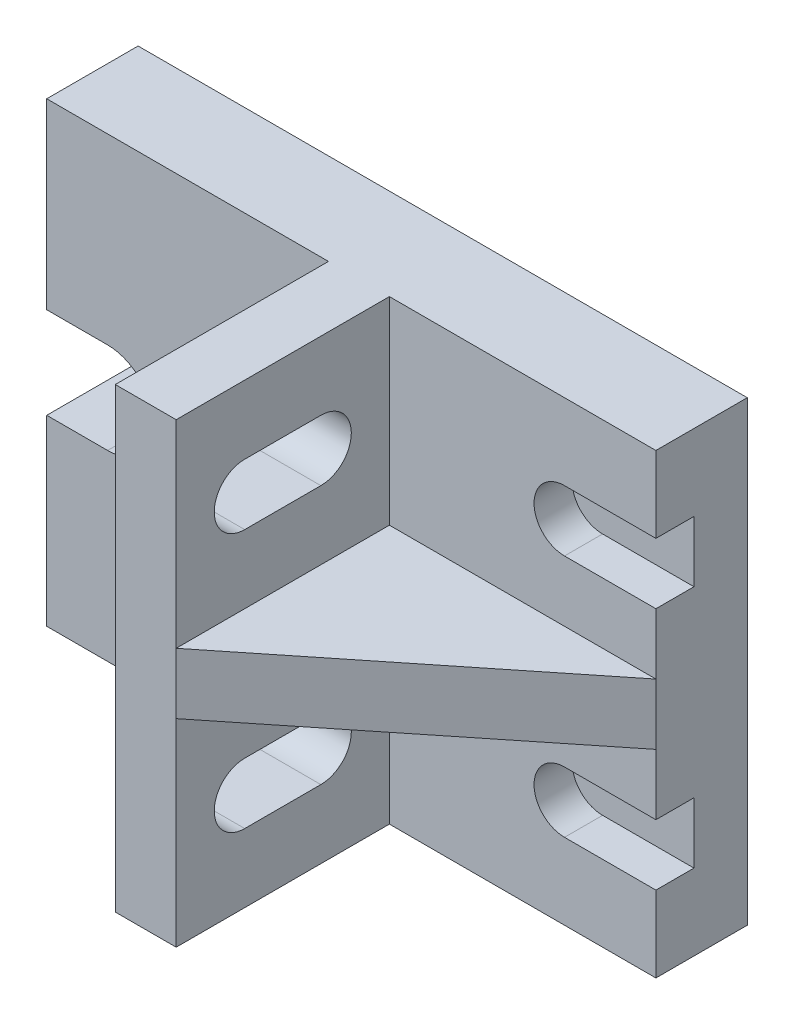
ISO-10303-21;
HEADER;
FILE_DESCRIPTION(('STEP AP214'),'2;1');
FILE_NAME('part.step','',(''),(''),'','','');
FILE_SCHEMA(('AUTOMOTIVE_DESIGN { 1 0 10303 214 1 1 1 1 }'));
ENDSEC;
DATA;
#1=APPLICATION_CONTEXT('core data for automotive mechanical design processes');
#2=APPLICATION_PROTOCOL_DEFINITION('international standard','automotive_design',2000,#1);
#3=PRODUCT_CONTEXT('',#1,'mechanical');
#4=PRODUCT('Part','Part','',(#3));
#5=PRODUCT_RELATED_PRODUCT_CATEGORY('part','',(#4));
#6=PRODUCT_DEFINITION_FORMATION('','',#4);
#7=PRODUCT_DEFINITION_CONTEXT('part definition',#1,'design');
#8=PRODUCT_DEFINITION('design','',#6,#7);
#9=PRODUCT_DEFINITION_SHAPE('','',#8);
#10=(LENGTH_UNIT() NAMED_UNIT(*) SI_UNIT(.MILLI.,.METRE.));
#11=(NAMED_UNIT(*) PLANE_ANGLE_UNIT() SI_UNIT($,.RADIAN.));
#12=(NAMED_UNIT(*) SI_UNIT($,.STERADIAN.) SOLID_ANGLE_UNIT());
#13=UNCERTAINTY_MEASURE_WITH_UNIT(LENGTH_MEASURE(1.E-05),#10,'distance_accuracy_value','');
#14=(GEOMETRIC_REPRESENTATION_CONTEXT(3) GLOBAL_UNCERTAINTY_ASSIGNED_CONTEXT((#13)) GLOBAL_UNIT_ASSIGNED_CONTEXT((#10,
#11,#12)) REPRESENTATION_CONTEXT('',''));
#15=CARTESIAN_POINT('',(0.,0.,0.));
#16=DIRECTION('',(0.,0.,1.));
#17=DIRECTION('',(1.,0.,0.));
#18=AXIS2_PLACEMENT_3D('',#15,#16,#17);
#19=CARTESIAN_POINT('',(0.,0.,30.));
#20=DIRECTION('',(0.,0.,1.));
#21=DIRECTION('',(1.,0.,0.));
#22=AXIS2_PLACEMENT_3D('',#19,#20,#21);
#23=PLANE('',#22);
#24=DIRECTION('',(0.,1.,0.));
#25=VECTOR('',#24,1.);
#26=CARTESIAN_POINT('',(200.,0.,30.));
#27=LINE('',#26,#25);
#28=CARTESIAN_POINT('',(200.,-105.,30.));
#29=VERTEX_POINT('',#28);
#30=CARTESIAN_POINT('',(200.,-85.,30.));
#31=VERTEX_POINT('',#30);
#32=EDGE_CURVE('E448',#29,#31,#27,.T.);
#33=ORIENTED_EDGE('',*,*,#32,.T.);
#34=DIRECTION('',(-1.,0.,0.));
#35=VECTOR('',#34,1.);
#36=CARTESIAN_POINT('',(200.,-85.,30.));
#37=LINE('',#36,#35);
#38=CARTESIAN_POINT('',(112.5,-85.,30.));
#39=VERTEX_POINT('',#38);
#40=EDGE_CURVE('E300',#31,#39,#37,.T.);
#41=ORIENTED_EDGE('',*,*,#40,.T.);
#42=DIRECTION('',(0.,-1.,0.));
#43=VECTOR('',#42,1.);
#44=CARTESIAN_POINT('',(112.5,0.,30.));
#45=LINE('',#44,#43);
#46=CARTESIAN_POINT('',(112.5,-150.,30.));
#47=VERTEX_POINT('',#46);
#48=EDGE_CURVE('E320',#39,#47,#45,.T.);
#49=ORIENTED_EDGE('',*,*,#48,.T.);
#50=DIRECTION('',(1.,0.,0.));
#51=VECTOR('',#50,1.);
#52=CARTESIAN_POINT('',(0.,-150.,30.));
#53=LINE('',#52,#51);
#54=CARTESIAN_POINT('',(200.,-150.,30.));
#55=VERTEX_POINT('',#54);
#56=EDGE_CURVE('E438',#47,#55,#53,.T.);
#57=ORIENTED_EDGE('',*,*,#56,.T.);
#58=CARTESIAN_POINT('',(200.,-125.,30.));
#59=VERTEX_POINT('',#58);
#60=EDGE_CURVE('E444',#55,#59,#27,.T.);
#61=ORIENTED_EDGE('',*,*,#60,.T.);
#62=DIRECTION('',(1.,0.,0.));
#63=VECTOR('',#62,1.);
#64=CARTESIAN_POINT('',(200.,-125.,30.));
#65=LINE('',#64,#63);
#66=CARTESIAN_POINT('',(170.,-125.,30.));
#67=VERTEX_POINT('',#66);
#68=EDGE_CURVE('E381',#67,#59,#65,.T.);
#69=ORIENTED_EDGE('',*,*,#68,.F.);
#70=CARTESIAN_POINT('',(170.,-115.,30.));
#71=DIRECTION('',(0.,0.,1.));
#72=DIRECTION('',(-1.,0.,0.));
#73=AXIS2_PLACEMENT_3D('',#70,#71,#72);
#74=CIRCLE('',#73,10.);
#75=CARTESIAN_POINT('',(170.,-105.,30.));
#76=VERTEX_POINT('',#75);
#77=EDGE_CURVE('E394',#76,#67,#74,.T.);
#78=ORIENTED_EDGE('',*,*,#77,.F.);
#79=DIRECTION('',(-1.,0.,0.));
#80=VECTOR('',#79,1.);
#81=CARTESIAN_POINT('',(200.,-105.,30.));
#82=LINE('',#81,#80);
#83=EDGE_CURVE('E391',#29,#76,#82,.T.);
#84=ORIENTED_EDGE('',*,*,#83,.F.);
#85=EDGE_LOOP('',(#33,#41,#49,#57,#61,#69,#78,#84));
#86=FACE_BOUND('',#85,.T.);
#87=ADVANCED_FACE('F33',(#86),#23,.T.);
#88=CARTESIAN_POINT('',(112.5,0.,100.));
#89=DIRECTION('',(1.,0.,0.));
#90=DIRECTION('',(0.,1.,0.));
#91=AXIS2_PLACEMENT_3D('',#88,#89,#90);
#92=PLANE('',#91);
#93=CARTESIAN_POINT('',(112.5,-117.5,52.5));
#94=DIRECTION('',(1.,0.,0.));
#95=DIRECTION('',(0.,1.,0.));
#96=AXIS2_PLACEMENT_3D('',#93,#94,#95);
#97=CIRCLE('',#96,10.);
#98=CARTESIAN_POINT('',(112.5,-127.5,52.5));
#99=VERTEX_POINT('',#98);
#100=CARTESIAN_POINT('',(112.5,-107.5,52.5));
#101=VERTEX_POINT('',#100);
#102=EDGE_CURVE('E48',#99,#101,#97,.T.);
#103=ORIENTED_EDGE('',*,*,#102,.F.);
#104=DIRECTION('',(0.,0.,-1.));
#105=VECTOR('',#104,1.);
#106=CARTESIAN_POINT('',(112.5,-127.5,52.5));
#107=LINE('',#106,#105);
#108=CARTESIAN_POINT('',(112.5,-127.5,77.5));
#109=VERTEX_POINT('',#108);
#110=EDGE_CURVE('E260',#109,#99,#107,.T.);
#111=ORIENTED_EDGE('',*,*,#110,.F.);
#112=CARTESIAN_POINT('',(112.5,-117.5,77.5));
#113=DIRECTION('',(1.,0.,0.));
#114=DIRECTION('',(0.,1.,0.));
#115=AXIS2_PLACEMENT_3D('',#112,#113,#114);
#116=CIRCLE('',#115,10.);
#117=CARTESIAN_POINT('',(112.5,-107.5,77.5));
#118=VERTEX_POINT('',#117);
#119=EDGE_CURVE('E243',#118,#109,#116,.T.);
#120=ORIENTED_EDGE('',*,*,#119,.F.);
#121=DIRECTION('',(0.,0.,1.));
#122=VECTOR('',#121,1.);
#123=CARTESIAN_POINT('',(112.5,-107.5,52.5));
#124=LINE('',#123,#122);
#125=EDGE_CURVE('E253',#101,#118,#124,.T.);
#126=ORIENTED_EDGE('',*,*,#125,.F.);
#127=EDGE_LOOP('',(#103,#111,#120,#126));
#128=FACE_BOUND('',#127,.T.);
#129=ORIENTED_EDGE('',*,*,#48,.F.);
#130=DIRECTION('',(0.,0.,1.));
#131=VECTOR('',#130,1.);
#132=CARTESIAN_POINT('',(112.5,-85.,30.));
#133=LINE('',#132,#131);
#134=CARTESIAN_POINT('',(112.5,-85.,100.));
#135=VERTEX_POINT('',#134);
#136=EDGE_CURVE('E302',#39,#135,#133,.T.);
#137=ORIENTED_EDGE('',*,*,#136,.T.);
#138=DIRECTION('',(0.,-1.,0.));
#139=VECTOR('',#138,1.);
#140=CARTESIAN_POINT('',(112.5,0.,100.));
#141=LINE('',#140,#139);
#142=CARTESIAN_POINT('',(112.5,-150.,100.));
#143=VERTEX_POINT('',#142);
#144=EDGE_CURVE('E325',#135,#143,#141,.T.);
#145=ORIENTED_EDGE('',*,*,#144,.T.);
#146=DIRECTION('',(0.,0.,-1.));
#147=VECTOR('',#146,1.);
#148=CARTESIAN_POINT('',(112.5,-150.,100.));
#149=LINE('',#148,#147);
#150=EDGE_CURVE('E346',#143,#47,#149,.T.);
#151=ORIENTED_EDGE('',*,*,#150,.T.);
#152=EDGE_LOOP('',(#129,#137,#145,#151));
#153=FACE_BOUND('',#152,.T.);
#154=ADVANCED_FACE('F257',(#128,#153),#92,.T.);
#155=DIRECTION('',(-1.,0.,0.));
#156=VECTOR('',#155,1.);
#157=CARTESIAN_POINT('',(200.,-65.,30.));
#158=LINE('',#157,#156);
#159=CARTESIAN_POINT('',(200.,-65.,30.));
#160=VERTEX_POINT('',#159);
#161=CARTESIAN_POINT('',(112.5,-65.,30.));
#162=VERTEX_POINT('',#161);
#163=EDGE_CURVE('E271',#160,#162,#158,.T.);
#164=ORIENTED_EDGE('',*,*,#163,.F.);
#165=CARTESIAN_POINT('',(200.,-45.,30.));
#166=VERTEX_POINT('',#165);
#167=EDGE_CURVE('E449',#160,#166,#27,.T.);
#168=ORIENTED_EDGE('',*,*,#167,.T.);
#169=DIRECTION('',(1.,0.,0.));
#170=VECTOR('',#169,1.);
#171=CARTESIAN_POINT('',(200.,-45.,30.));
#172=LINE('',#171,#170);
#173=CARTESIAN_POINT('',(170.,-45.,30.));
#174=VERTEX_POINT('',#173);
#175=EDGE_CURVE('E422',#174,#166,#172,.T.);
#176=ORIENTED_EDGE('',*,*,#175,.F.);
#177=CARTESIAN_POINT('',(170.,-35.,30.));
#178=DIRECTION('',(0.,0.,1.));
#179=DIRECTION('',(1.,0.,0.));
#180=AXIS2_PLACEMENT_3D('',#177,#178,#179);
#181=CIRCLE('',#180,10.);
#182=CARTESIAN_POINT('',(170.,-25.,30.));
#183=VERTEX_POINT('',#182);
#184=EDGE_CURVE('E376',#183,#174,#181,.T.);
#185=ORIENTED_EDGE('',*,*,#184,.F.);
#186=DIRECTION('',(-1.,0.,0.));
#187=VECTOR('',#186,1.);
#188=CARTESIAN_POINT('',(200.,-25.,30.));
#189=LINE('',#188,#187);
#190=CARTESIAN_POINT('',(200.,-25.,30.));
#191=VERTEX_POINT('',#190);
#192=EDGE_CURVE('E412',#191,#183,#189,.T.);
#193=ORIENTED_EDGE('',*,*,#192,.F.);
#194=CARTESIAN_POINT('',(200.,0.,30.));
#195=VERTEX_POINT('',#194);
#196=EDGE_CURVE('E443',#191,#195,#27,.T.);
#197=ORIENTED_EDGE('',*,*,#196,.T.);
#198=DIRECTION('',(-1.,0.,0.));
#199=VECTOR('',#198,1.);
#200=CARTESIAN_POINT('',(0.,0.,30.));
#201=LINE('',#200,#199);
#202=CARTESIAN_POINT('',(112.5,0.,30.));
#203=VERTEX_POINT('',#202);
#204=EDGE_CURVE('E450',#195,#203,#201,.T.);
#205=ORIENTED_EDGE('',*,*,#204,.T.);
#206=EDGE_CURVE('E336',#203,#162,#45,.T.);
#207=ORIENTED_EDGE('',*,*,#206,.T.);
#208=EDGE_LOOP('',(#164,#168,#176,#185,#193,#197,#205,#207));
#209=FACE_BOUND('',#208,.T.);
#210=ADVANCED_FACE('F556',(#209),#23,.T.);
#211=CARTESIAN_POINT('',(0.,0.,30.));
#212=DIRECTION('',(1.,0.,0.));
#213=DIRECTION('',(0.,1.,0.));
#214=AXIS2_PLACEMENT_3D('',#211,#212,#213);
#215=PLANE('',#214);
#216=DIRECTION('',(0.,0.,1.));
#217=VECTOR('',#216,1.);
#218=CARTESIAN_POINT('',(0.,-60.,0.));
#219=LINE('',#218,#217);
#220=CARTESIAN_POINT('',(0.,-60.,0.));
#221=VERTEX_POINT('',#220);
#222=CARTESIAN_POINT('',(0.,-60.,30.));
#223=VERTEX_POINT('',#222);
#224=EDGE_CURVE('E359',#221,#223,#219,.T.);
#225=ORIENTED_EDGE('',*,*,#224,.T.);
#226=DIRECTION('',(0.,-1.,0.));
#227=VECTOR('',#226,1.);
#228=CARTESIAN_POINT('',(0.,0.,30.));
#229=LINE('',#228,#227);
#230=CARTESIAN_POINT('',(0.,0.,30.));
#231=VERTEX_POINT('',#230);
#232=EDGE_CURVE('E435',#231,#223,#229,.T.);
#233=ORIENTED_EDGE('',*,*,#232,.F.);
#234=DIRECTION('',(0.,0.,-1.));
#235=VECTOR('',#234,1.);
#236=CARTESIAN_POINT('',(0.,0.,30.));
#237=LINE('',#236,#235);
#238=CARTESIAN_POINT('',(0.,0.,0.));
#239=VERTEX_POINT('',#238);
#240=EDGE_CURVE('E453',#231,#239,#237,.T.);
#241=ORIENTED_EDGE('',*,*,#240,.T.);
#242=DIRECTION('',(0.,-1.,0.));
#243=VECTOR('',#242,1.);
#244=CARTESIAN_POINT('',(0.,0.,0.));
#245=LINE('',#244,#243);
#246=EDGE_CURVE('E454',#239,#221,#245,.T.);
#247=ORIENTED_EDGE('',*,*,#246,.T.);
#248=EDGE_LOOP('',(#225,#233,#241,#247));
#249=FACE_BOUND('',#248,.T.);
#250=ADVANCED_FACE('F491',(#249),#215,.F.);
#251=DIRECTION('',(0.,-1.,0.));
#252=VECTOR('',#251,1.);
#253=CARTESIAN_POINT('',(92.5,0.,30.));
#254=LINE('',#253,#252);
#255=CARTESIAN_POINT('',(92.5,0.,30.));
#256=VERTEX_POINT('',#255);
#257=CARTESIAN_POINT('',(92.5,-150.,30.));
#258=VERTEX_POINT('',#257);
#259=EDGE_CURVE('E326',#256,#258,#254,.T.);
#260=ORIENTED_EDGE('',*,*,#259,.F.);
#261=EDGE_CURVE('E447',#256,#231,#201,.T.);
#262=ORIENTED_EDGE('',*,*,#261,.T.);
#263=ORIENTED_EDGE('',*,*,#232,.T.);
#264=DIRECTION('',(1.,0.,0.));
#265=VECTOR('',#264,1.);
#266=CARTESIAN_POINT('',(0.,-60.,30.));
#267=LINE('',#266,#265);
#268=CARTESIAN_POINT('',(20.,-60.,30.));
#269=VERTEX_POINT('',#268);
#270=EDGE_CURVE('E349',#223,#269,#267,.T.);
#271=ORIENTED_EDGE('',*,*,#270,.T.);
#272=CARTESIAN_POINT('',(20.,-75.,30.));
#273=DIRECTION('',(0.,0.,-1.));
#274=DIRECTION('',(-1.,0.,0.));
#275=AXIS2_PLACEMENT_3D('',#272,#273,#274);
#276=CIRCLE('',#275,15.);
#277=CARTESIAN_POINT('',(20.,-90.,30.));
#278=VERTEX_POINT('',#277);
#279=EDGE_CURVE('E362',#269,#278,#276,.T.);
#280=ORIENTED_EDGE('',*,*,#279,.T.);
#281=DIRECTION('',(1.,0.,0.));
#282=VECTOR('',#281,1.);
#283=CARTESIAN_POINT('',(0.,-90.,30.));
#284=LINE('',#283,#282);
#285=CARTESIAN_POINT('',(0.,-90.,30.));
#286=VERTEX_POINT('',#285);
#287=EDGE_CURVE('E353',#286,#278,#284,.T.);
#288=ORIENTED_EDGE('',*,*,#287,.F.);
#289=CARTESIAN_POINT('',(0.,-150.,30.));
#290=VERTEX_POINT('',#289);
#291=EDGE_CURVE('E439',#286,#290,#229,.T.);
#292=ORIENTED_EDGE('',*,*,#291,.T.);
#293=EDGE_CURVE('E440',#290,#258,#53,.T.);
#294=ORIENTED_EDGE('',*,*,#293,.T.);
#295=EDGE_LOOP('',(#260,#262,#263,#271,#280,#288,#292,#294));
#296=FACE_BOUND('',#295,.T.);
#297=ADVANCED_FACE('F494',(#296),#23,.T.);
#298=CARTESIAN_POINT('',(0.,0.,0.));
#299=DIRECTION('',(0.,0.,1.));
#300=DIRECTION('',(1.,0.,0.));
#301=AXIS2_PLACEMENT_3D('',#298,#299,#300);
#302=PLANE('',#301);
#303=DIRECTION('',(1.,0.,0.));
#304=VECTOR('',#303,1.);
#305=CARTESIAN_POINT('',(0.,-60.,0.));
#306=LINE('',#305,#304);
#307=CARTESIAN_POINT('',(20.,-60.,0.));
#308=VERTEX_POINT('',#307);
#309=EDGE_CURVE('E350',#221,#308,#306,.T.);
#310=ORIENTED_EDGE('',*,*,#309,.F.);
#311=ORIENTED_EDGE('',*,*,#246,.F.);
#312=DIRECTION('',(-1.,0.,0.));
#313=VECTOR('',#312,1.);
#314=CARTESIAN_POINT('',(0.,0.,0.));
#315=LINE('',#314,#313);
#316=CARTESIAN_POINT('',(200.,0.,0.));
#317=VERTEX_POINT('',#316);
#318=EDGE_CURVE('E461',#317,#239,#315,.T.);
#319=ORIENTED_EDGE('',*,*,#318,.F.);
#320=DIRECTION('',(0.,1.,0.));
#321=VECTOR('',#320,1.);
#322=CARTESIAN_POINT('',(200.,0.,0.));
#323=LINE('',#322,#321);
#324=CARTESIAN_POINT('',(200.,-150.,0.));
#325=VERTEX_POINT('',#324);
#326=EDGE_CURVE('E459',#325,#317,#323,.T.);
#327=ORIENTED_EDGE('',*,*,#326,.F.);
#328=DIRECTION('',(1.,0.,0.));
#329=VECTOR('',#328,1.);
#330=CARTESIAN_POINT('',(0.,-150.,0.));
#331=LINE('',#330,#329);
#332=CARTESIAN_POINT('',(0.,-150.,0.));
#333=VERTEX_POINT('',#332);
#334=EDGE_CURVE('E457',#333,#325,#331,.T.);
#335=ORIENTED_EDGE('',*,*,#334,.F.);
#336=CARTESIAN_POINT('',(0.,-90.,0.));
#337=VERTEX_POINT('',#336);
#338=EDGE_CURVE('E402',#337,#333,#245,.T.);
#339=ORIENTED_EDGE('',*,*,#338,.F.);
#340=DIRECTION('',(1.,0.,0.));
#341=VECTOR('',#340,1.);
#342=CARTESIAN_POINT('',(0.,-90.,0.));
#343=LINE('',#342,#341);
#344=CARTESIAN_POINT('',(20.,-90.,0.));
#345=VERTEX_POINT('',#344);
#346=EDGE_CURVE('E356',#337,#345,#343,.T.);
#347=ORIENTED_EDGE('',*,*,#346,.T.);
#348=CARTESIAN_POINT('',(20.,-75.,0.));
#349=DIRECTION('',(0.,0.,-1.));
#350=DIRECTION('',(-1.,0.,0.));
#351=AXIS2_PLACEMENT_3D('',#348,#349,#350);
#352=CIRCLE('',#351,15.);
#353=EDGE_CURVE('E352',#308,#345,#352,.T.);
#354=ORIENTED_EDGE('',*,*,#353,.F.);
#355=EDGE_LOOP('',(#310,#311,#319,#327,#335,#339,#347,#354));
#356=FACE_BOUND('',#355,.T.);
#357=ADVANCED_FACE('F481',(#356),#302,.F.);
#358=ORIENTED_EDGE('',*,*,#291,.F.);
#359=DIRECTION('',(0.,0.,1.));
#360=VECTOR('',#359,1.);
#361=CARTESIAN_POINT('',(0.,-90.,0.));
#362=LINE('',#361,#360);
#363=EDGE_CURVE('E369',#337,#286,#362,.T.);
#364=ORIENTED_EDGE('',*,*,#363,.F.);
#365=ORIENTED_EDGE('',*,*,#338,.T.);
#366=DIRECTION('',(0.,0.,-1.));
#367=VECTOR('',#366,1.);
#368=CARTESIAN_POINT('',(0.,-150.,30.));
#369=LINE('',#368,#367);
#370=EDGE_CURVE('E11',#290,#333,#369,.T.);
#371=ORIENTED_EDGE('',*,*,#370,.F.);
#372=EDGE_LOOP('',(#358,#364,#365,#371));
#373=FACE_BOUND('',#372,.T.);
#374=ADVANCED_FACE('F35',(#373),#215,.F.);
#375=CARTESIAN_POINT('',(0.,-150.,30.));
#376=DIRECTION('',(0.,1.,0.));
#377=DIRECTION('',(0.,0.,1.));
#378=AXIS2_PLACEMENT_3D('',#375,#376,#377);
#379=PLANE('',#378);
#380=ORIENTED_EDGE('',*,*,#334,.T.);
#381=DIRECTION('',(0.,0.,-1.));
#382=VECTOR('',#381,1.);
#383=CARTESIAN_POINT('',(200.,-150.,30.));
#384=LINE('',#383,#382);
#385=EDGE_CURVE('E41',#55,#325,#384,.T.);
#386=ORIENTED_EDGE('',*,*,#385,.F.);
#387=ORIENTED_EDGE('',*,*,#56,.F.);
#388=ORIENTED_EDGE('',*,*,#150,.F.);
#389=DIRECTION('',(1.,0.,0.));
#390=VECTOR('',#389,1.);
#391=CARTESIAN_POINT('',(92.5,-150.,100.));
#392=LINE('',#391,#390);
#393=CARTESIAN_POINT('',(92.5,-150.,100.));
#394=VERTEX_POINT('',#393);
#395=EDGE_CURVE('E322',#394,#143,#392,.T.);
#396=ORIENTED_EDGE('',*,*,#395,.F.);
#397=DIRECTION('',(0.,0.,-1.));
#398=VECTOR('',#397,1.);
#399=CARTESIAN_POINT('',(92.5,-150.,100.));
#400=LINE('',#399,#398);
#401=EDGE_CURVE('E335',#394,#258,#400,.T.);
#402=ORIENTED_EDGE('',*,*,#401,.T.);
#403=ORIENTED_EDGE('',*,*,#293,.F.);
#404=ORIENTED_EDGE('',*,*,#370,.T.);
#405=EDGE_LOOP('',(#380,#386,#387,#388,#396,#402,#403,#404));
#406=FACE_BOUND('',#405,.T.);
#407=ADVANCED_FACE('F528',(#406),#379,.F.);
#408=CARTESIAN_POINT('',(200.,0.,30.));
#409=DIRECTION('',(-1.,0.,0.));
#410=DIRECTION('',(0.,-1.,0.));
#411=AXIS2_PLACEMENT_3D('',#408,#409,#410);
#412=PLANE('',#411);
#413=DIRECTION('',(0.,1.,0.));
#414=VECTOR('',#413,1.);
#415=CARTESIAN_POINT('',(200.,-105.,17.5));
#416=LINE('',#415,#414);
#417=CARTESIAN_POINT('',(200.,-125.,17.5));
#418=VERTEX_POINT('',#417);
#419=CARTESIAN_POINT('',(200.,-105.,17.5));
#420=VERTEX_POINT('',#419);
#421=EDGE_CURVE('E377',#418,#420,#416,.T.);
#422=ORIENTED_EDGE('',*,*,#421,.F.);
#423=DIRECTION('',(0.,0.,1.));
#424=VECTOR('',#423,1.);
#425=CARTESIAN_POINT('',(200.,-125.,17.5));
#426=LINE('',#425,#424);
#427=EDGE_CURVE('E399',#418,#59,#426,.T.);
#428=ORIENTED_EDGE('',*,*,#427,.T.);
#429=ORIENTED_EDGE('',*,*,#60,.F.);
#430=ORIENTED_EDGE('',*,*,#385,.T.);
#431=ORIENTED_EDGE('',*,*,#326,.T.);
#432=DIRECTION('',(0.,0.,-1.));
#433=VECTOR('',#432,1.);
#434=CARTESIAN_POINT('',(200.,0.,30.));
#435=LINE('',#434,#433);
#436=EDGE_CURVE('E465',#195,#317,#435,.T.);
#437=ORIENTED_EDGE('',*,*,#436,.F.);
#438=ORIENTED_EDGE('',*,*,#196,.F.);
#439=DIRECTION('',(0.,0.,1.));
#440=VECTOR('',#439,1.);
#441=CARTESIAN_POINT('',(200.,-25.,17.5));
#442=LINE('',#441,#440);
#443=CARTESIAN_POINT('',(200.,-25.,17.5));
#444=VERTEX_POINT('',#443);
#445=EDGE_CURVE('E428',#444,#191,#442,.T.);
#446=ORIENTED_EDGE('',*,*,#445,.F.);
#447=DIRECTION('',(0.,1.,0.));
#448=VECTOR('',#447,1.);
#449=CARTESIAN_POINT('',(200.,-25.,17.5));
#450=LINE('',#449,#448);
#451=CARTESIAN_POINT('',(200.,-45.,17.5));
#452=VERTEX_POINT('',#451);
#453=EDGE_CURVE('E415',#452,#444,#450,.T.);
#454=ORIENTED_EDGE('',*,*,#453,.F.);
#455=DIRECTION('',(0.,0.,1.));
#456=VECTOR('',#455,1.);
#457=CARTESIAN_POINT('',(200.,-45.,17.5));
#458=LINE('',#457,#456);
#459=EDGE_CURVE('E430',#452,#166,#458,.T.);
#460=ORIENTED_EDGE('',*,*,#459,.T.);
#461=ORIENTED_EDGE('',*,*,#167,.F.);
#462=DIRECTION('',(0.,1.,0.));
#463=VECTOR('',#462,1.);
#464=CARTESIAN_POINT('',(200.,-85.,30.));
#465=LINE('',#464,#463);
#466=EDGE_CURVE('E317',#31,#160,#465,.T.);
#467=ORIENTED_EDGE('',*,*,#466,.F.);
#468=ORIENTED_EDGE('',*,*,#32,.F.);
#469=DIRECTION('',(0.,0.,1.));
#470=VECTOR('',#469,1.);
#471=CARTESIAN_POINT('',(200.,-105.,17.5));
#472=LINE('',#471,#470);
#473=EDGE_CURVE('E390',#420,#29,#472,.T.);
#474=ORIENTED_EDGE('',*,*,#473,.F.);
#475=EDGE_LOOP('',(#422,#428,#429,#430,#431,#437,#438,#446,#454,#460,#461,#467,#468,#474));
#476=FACE_BOUND('',#475,.T.);
#477=ADVANCED_FACE('F473',(#476),#412,.F.);
#478=CARTESIAN_POINT('',(0.,0.,30.));
#479=DIRECTION('',(0.,-1.,0.));
#480=DIRECTION('',(0.,0.,-1.));
#481=AXIS2_PLACEMENT_3D('',#478,#479,#480);
#482=PLANE('',#481);
#483=ORIENTED_EDGE('',*,*,#318,.T.);
#484=ORIENTED_EDGE('',*,*,#240,.F.);
#485=ORIENTED_EDGE('',*,*,#261,.F.);
#486=DIRECTION('',(0.,0.,-1.));
#487=VECTOR('',#486,1.);
#488=CARTESIAN_POINT('',(92.5,0.,100.));
#489=LINE('',#488,#487);
#490=CARTESIAN_POINT('',(92.5,0.,100.));
#491=VERTEX_POINT('',#490);
#492=EDGE_CURVE('E342',#491,#256,#489,.T.);
#493=ORIENTED_EDGE('',*,*,#492,.F.);
#494=DIRECTION('',(1.,0.,0.));
#495=VECTOR('',#494,1.);
#496=CARTESIAN_POINT('',(92.5,0.,100.));
#497=LINE('',#496,#495);
#498=CARTESIAN_POINT('',(112.5,0.,100.));
#499=VERTEX_POINT('',#498);
#500=EDGE_CURVE('E330',#491,#499,#497,.T.);
#501=ORIENTED_EDGE('',*,*,#500,.T.);
#502=DIRECTION('',(0.,0.,-1.));
#503=VECTOR('',#502,1.);
#504=CARTESIAN_POINT('',(112.5,0.,100.));
#505=LINE('',#504,#503);
#506=EDGE_CURVE('E344',#499,#203,#505,.T.);
#507=ORIENTED_EDGE('',*,*,#506,.T.);
#508=ORIENTED_EDGE('',*,*,#204,.F.);
#509=ORIENTED_EDGE('',*,*,#436,.T.);
#510=EDGE_LOOP('',(#483,#484,#485,#493,#501,#507,#508,#509));
#511=FACE_BOUND('',#510,.T.);
#512=ADVANCED_FACE('F486',(#511),#482,.F.);
#513=CARTESIAN_POINT('',(170.,-35.,17.5));
#514=DIRECTION('',(0.,0.,1.));
#515=DIRECTION('',(1.,0.,0.));
#516=AXIS2_PLACEMENT_3D('',#513,#514,#515);
#517=CYLINDRICAL_SURFACE('',#516,10.);
#518=ORIENTED_EDGE('',*,*,#184,.T.);
#519=DIRECTION('',(0.,0.,1.));
#520=VECTOR('',#519,1.);
#521=CARTESIAN_POINT('',(170.,-45.,17.5));
#522=LINE('',#521,#520);
#523=CARTESIAN_POINT('',(170.,-45.,17.5));
#524=VERTEX_POINT('',#523);
#525=EDGE_CURVE('E420',#524,#174,#522,.T.);
#526=ORIENTED_EDGE('',*,*,#525,.F.);
#527=CARTESIAN_POINT('',(170.,-35.,17.5));
#528=DIRECTION('',(0.,0.,1.));
#529=DIRECTION('',(1.,0.,0.));
#530=AXIS2_PLACEMENT_3D('',#527,#528,#529);
#531=CIRCLE('',#530,10.);
#532=CARTESIAN_POINT('',(170.,-25.,17.5));
#533=VERTEX_POINT('',#532);
#534=EDGE_CURVE('E408',#533,#524,#531,.T.);
#535=ORIENTED_EDGE('',*,*,#534,.F.);
#536=DIRECTION('',(0.,0.,1.));
#537=VECTOR('',#536,1.);
#538=CARTESIAN_POINT('',(170.,-25.,17.5));
#539=LINE('',#538,#537);
#540=EDGE_CURVE('E395',#533,#183,#539,.T.);
#541=ORIENTED_EDGE('',*,*,#540,.T.);
#542=EDGE_LOOP('',(#518,#526,#535,#541));
#543=FACE_BOUND('',#542,.T.);
#544=ADVANCED_FACE('F582',(#543),#517,.F.);
#545=CARTESIAN_POINT('',(200.,-25.,17.5));
#546=DIRECTION('',(0.,1.,0.));
#547=DIRECTION('',(0.,0.,1.));
#548=AXIS2_PLACEMENT_3D('',#545,#546,#547);
#549=PLANE('',#548);
#550=ORIENTED_EDGE('',*,*,#192,.T.);
#551=ORIENTED_EDGE('',*,*,#540,.F.);
#552=DIRECTION('',(-1.,0.,0.));
#553=VECTOR('',#552,1.);
#554=CARTESIAN_POINT('',(200.,-25.,17.5));
#555=LINE('',#554,#553);
#556=EDGE_CURVE('E417',#444,#533,#555,.T.);
#557=ORIENTED_EDGE('',*,*,#556,.F.);
#558=ORIENTED_EDGE('',*,*,#445,.T.);
#559=EDGE_LOOP('',(#550,#551,#557,#558));
#560=FACE_BOUND('',#559,.T.);
#561=ADVANCED_FACE('F586',(#560),#549,.F.);
#562=CARTESIAN_POINT('',(200.,-45.,17.5));
#563=DIRECTION('',(0.,-1.,0.));
#564=DIRECTION('',(1.,0.,0.));
#565=AXIS2_PLACEMENT_3D('',#562,#563,#564);
#566=PLANE('',#565);
#567=ORIENTED_EDGE('',*,*,#175,.T.);
#568=ORIENTED_EDGE('',*,*,#459,.F.);
#569=DIRECTION('',(1.,0.,0.));
#570=VECTOR('',#569,1.);
#571=CARTESIAN_POINT('',(200.,-45.,17.5));
#572=LINE('',#571,#570);
#573=EDGE_CURVE('E411',#524,#452,#572,.T.);
#574=ORIENTED_EDGE('',*,*,#573,.F.);
#575=ORIENTED_EDGE('',*,*,#525,.T.);
#576=EDGE_LOOP('',(#567,#568,#574,#575));
#577=FACE_BOUND('',#576,.T.);
#578=ADVANCED_FACE('F591',(#577),#566,.F.);
#579=CARTESIAN_POINT('',(170.,-35.,17.5));
#580=DIRECTION('',(0.,0.,1.));
#581=DIRECTION('',(1.,0.,0.));
#582=AXIS2_PLACEMENT_3D('',#579,#580,#581);
#583=PLANE('',#582);
#584=ORIENTED_EDGE('',*,*,#534,.T.);
#585=ORIENTED_EDGE('',*,*,#573,.T.);
#586=ORIENTED_EDGE('',*,*,#453,.T.);
#587=ORIENTED_EDGE('',*,*,#556,.T.);
#588=EDGE_LOOP('',(#584,#585,#586,#587));
#589=FACE_BOUND('',#588,.T.);
#590=ADVANCED_FACE('F596',(#589),#583,.T.);
#591=CARTESIAN_POINT('',(200.,-125.,17.5));
#592=DIRECTION('',(0.,-1.,0.));
#593=DIRECTION('',(0.,0.,-1.));
#594=AXIS2_PLACEMENT_3D('',#591,#592,#593);
#595=PLANE('',#594);
#596=ORIENTED_EDGE('',*,*,#68,.T.);
#597=ORIENTED_EDGE('',*,*,#427,.F.);
#598=DIRECTION('',(1.,0.,0.));
#599=VECTOR('',#598,1.);
#600=CARTESIAN_POINT('',(200.,-125.,17.5));
#601=LINE('',#600,#599);
#602=CARTESIAN_POINT('',(170.,-125.,17.5));
#603=VERTEX_POINT('',#602);
#604=EDGE_CURVE('E387',#603,#418,#601,.T.);
#605=ORIENTED_EDGE('',*,*,#604,.F.);
#606=DIRECTION('',(0.,0.,1.));
#607=VECTOR('',#606,1.);
#608=CARTESIAN_POINT('',(170.,-125.,17.5));
#609=LINE('',#608,#607);
#610=EDGE_CURVE('E403',#603,#67,#609,.T.);
#611=ORIENTED_EDGE('',*,*,#610,.T.);
#612=EDGE_LOOP('',(#596,#597,#605,#611));
#613=FACE_BOUND('',#612,.T.);
#614=ADVANCED_FACE('F601',(#613),#595,.F.);
#615=CARTESIAN_POINT('',(170.,-115.,17.5));
#616=DIRECTION('',(0.,0.,1.));
#617=DIRECTION('',(1.,0.,0.));
#618=AXIS2_PLACEMENT_3D('',#615,#616,#617);
#619=CYLINDRICAL_SURFACE('',#618,10.);
#620=ORIENTED_EDGE('',*,*,#77,.T.);
#621=ORIENTED_EDGE('',*,*,#610,.F.);
#622=CARTESIAN_POINT('',(170.,-115.,17.5));
#623=DIRECTION('',(0.,0.,1.));
#624=DIRECTION('',(-1.,0.,0.));
#625=AXIS2_PLACEMENT_3D('',#622,#623,#624);
#626=CIRCLE('',#625,10.);
#627=CARTESIAN_POINT('',(170.,-105.,17.5));
#628=VERTEX_POINT('',#627);
#629=EDGE_CURVE('E384',#628,#603,#626,.T.);
#630=ORIENTED_EDGE('',*,*,#629,.F.);
#631=DIRECTION('',(0.,0.,1.));
#632=VECTOR('',#631,1.);
#633=CARTESIAN_POINT('',(170.,-105.,17.5));
#634=LINE('',#633,#632);
#635=EDGE_CURVE('E405',#628,#76,#634,.T.);
#636=ORIENTED_EDGE('',*,*,#635,.T.);
#637=EDGE_LOOP('',(#620,#621,#630,#636));
#638=FACE_BOUND('',#637,.T.);
#639=ADVANCED_FACE('F605',(#638),#619,.F.);
#640=CARTESIAN_POINT('',(200.,-105.,17.5));
#641=DIRECTION('',(0.,1.,0.));
#642=DIRECTION('',(-1.,0.,0.));
#643=AXIS2_PLACEMENT_3D('',#640,#641,#642);
#644=PLANE('',#643);
#645=ORIENTED_EDGE('',*,*,#83,.T.);
#646=ORIENTED_EDGE('',*,*,#635,.F.);
#647=DIRECTION('',(-1.,0.,0.));
#648=VECTOR('',#647,1.);
#649=CARTESIAN_POINT('',(200.,-105.,17.5));
#650=LINE('',#649,#648);
#651=EDGE_CURVE('E380',#420,#628,#650,.T.);
#652=ORIENTED_EDGE('',*,*,#651,.F.);
#653=ORIENTED_EDGE('',*,*,#473,.T.);
#654=EDGE_LOOP('',(#645,#646,#652,#653));
#655=FACE_BOUND('',#654,.T.);
#656=ADVANCED_FACE('F551',(#655),#644,.F.);
#657=CARTESIAN_POINT('',(170.,-115.,17.5));
#658=DIRECTION('',(0.,0.,-1.));
#659=DIRECTION('',(-1.,0.,0.));
#660=AXIS2_PLACEMENT_3D('',#657,#658,#659);
#661=PLANE('',#660);
#662=ORIENTED_EDGE('',*,*,#421,.T.);
#663=ORIENTED_EDGE('',*,*,#651,.T.);
#664=ORIENTED_EDGE('',*,*,#629,.T.);
#665=ORIENTED_EDGE('',*,*,#604,.T.);
#666=EDGE_LOOP('',(#662,#663,#664,#665));
#667=FACE_BOUND('',#666,.T.);
#668=ADVANCED_FACE('F544',(#667),#661,.F.);
#669=CARTESIAN_POINT('',(0.,-60.,0.));
#670=DIRECTION('',(0.,-1.,0.));
#671=DIRECTION('',(0.,0.,-1.));
#672=AXIS2_PLACEMENT_3D('',#669,#670,#671);
#673=PLANE('',#672);
#674=ORIENTED_EDGE('',*,*,#270,.F.);
#675=ORIENTED_EDGE('',*,*,#224,.F.);
#676=ORIENTED_EDGE('',*,*,#309,.T.);
#677=DIRECTION('',(0.,0.,1.));
#678=VECTOR('',#677,1.);
#679=CARTESIAN_POINT('',(20.,-60.,0.));
#680=LINE('',#679,#678);
#681=EDGE_CURVE('E373',#308,#269,#680,.T.);
#682=ORIENTED_EDGE('',*,*,#681,.T.);
#683=EDGE_LOOP('',(#674,#675,#676,#682));
#684=FACE_BOUND('',#683,.T.);
#685=ADVANCED_FACE('F542',(#684),#673,.T.);
#686=CARTESIAN_POINT('',(20.,-75.,0.));
#687=DIRECTION('',(0.,0.,1.));
#688=DIRECTION('',(1.,0.,0.));
#689=AXIS2_PLACEMENT_3D('',#686,#687,#688);
#690=CYLINDRICAL_SURFACE('',#689,15.);
#691=ORIENTED_EDGE('',*,*,#279,.F.);
#692=ORIENTED_EDGE('',*,*,#681,.F.);
#693=ORIENTED_EDGE('',*,*,#353,.T.);
#694=DIRECTION('',(0.,0.,1.));
#695=VECTOR('',#694,1.);
#696=CARTESIAN_POINT('',(20.,-90.,0.));
#697=LINE('',#696,#695);
#698=EDGE_CURVE('E371',#345,#278,#697,.T.);
#699=ORIENTED_EDGE('',*,*,#698,.T.);
#700=EDGE_LOOP('',(#691,#692,#693,#699));
#701=FACE_BOUND('',#700,.T.);
#702=ADVANCED_FACE('F540',(#701),#690,.F.);
#703=CARTESIAN_POINT('',(0.,-90.,0.));
#704=DIRECTION('',(0.,-1.,0.));
#705=DIRECTION('',(0.,0.,-1.));
#706=AXIS2_PLACEMENT_3D('',#703,#704,#705);
#707=PLANE('',#706);
#708=ORIENTED_EDGE('',*,*,#287,.T.);
#709=ORIENTED_EDGE('',*,*,#698,.F.);
#710=ORIENTED_EDGE('',*,*,#346,.F.);
#711=ORIENTED_EDGE('',*,*,#363,.T.);
#712=EDGE_LOOP('',(#708,#709,#710,#711));
#713=FACE_BOUND('',#712,.T.);
#714=ADVANCED_FACE('F537',(#713),#707,.F.);
#715=CARTESIAN_POINT('',(112.5,-32.5,52.5));
#716=DIRECTION('',(1.,0.,0.));
#717=DIRECTION('',(0.,-1.,0.));
#718=AXIS2_PLACEMENT_3D('',#715,#716,#717);
#719=CIRCLE('',#718,10.);
#720=CARTESIAN_POINT('',(112.5,-42.5,52.5));
#721=VERTEX_POINT('',#720);
#722=CARTESIAN_POINT('',(112.5,-22.5,52.5));
#723=VERTEX_POINT('',#722);
#724=EDGE_CURVE('E56',#721,#723,#719,.T.);
#725=ORIENTED_EDGE('',*,*,#724,.F.);
#726=DIRECTION('',(0.,0.,-1.));
#727=VECTOR('',#726,1.);
#728=CARTESIAN_POINT('',(112.5,-42.5,52.5));
#729=LINE('',#728,#727);
#730=CARTESIAN_POINT('',(112.5,-42.5,77.5));
#731=VERTEX_POINT('',#730);
#732=EDGE_CURVE('E289',#731,#721,#729,.T.);
#733=ORIENTED_EDGE('',*,*,#732,.F.);
#734=CARTESIAN_POINT('',(112.5,-32.5,77.5));
#735=DIRECTION('',(1.,0.,0.));
#736=DIRECTION('',(0.,-1.,0.));
#737=AXIS2_PLACEMENT_3D('',#734,#735,#736);
#738=CIRCLE('',#737,10.);
#739=CARTESIAN_POINT('',(112.5,-22.5,77.5));
#740=VERTEX_POINT('',#739);
#741=EDGE_CURVE('E286',#740,#731,#738,.T.);
#742=ORIENTED_EDGE('',*,*,#741,.F.);
#743=DIRECTION('',(0.,0.,1.));
#744=VECTOR('',#743,1.);
#745=CARTESIAN_POINT('',(112.5,-22.5,52.5));
#746=LINE('',#745,#744);
#747=EDGE_CURVE('E283',#723,#740,#746,.T.);
#748=ORIENTED_EDGE('',*,*,#747,.F.);
#749=EDGE_LOOP('',(#725,#733,#742,#748));
#750=FACE_BOUND('',#749,.T.);
#751=DIRECTION('',(0.,0.,1.));
#752=VECTOR('',#751,1.);
#753=CARTESIAN_POINT('',(112.5,-65.,30.));
#754=LINE('',#753,#752);
#755=CARTESIAN_POINT('',(112.5,-65.,100.));
#756=VERTEX_POINT('',#755);
#757=EDGE_CURVE('E312',#162,#756,#754,.T.);
#758=ORIENTED_EDGE('',*,*,#757,.F.);
#759=ORIENTED_EDGE('',*,*,#206,.F.);
#760=ORIENTED_EDGE('',*,*,#506,.F.);
#761=EDGE_CURVE('E327',#499,#756,#141,.T.);
#762=ORIENTED_EDGE('',*,*,#761,.T.);
#763=EDGE_LOOP('',(#758,#759,#760,#762));
#764=FACE_BOUND('',#763,.T.);
#765=ADVANCED_FACE('F506',(#750,#764),#92,.T.);
#766=CARTESIAN_POINT('',(92.5,0.,100.));
#767=DIRECTION('',(1.,0.,0.));
#768=DIRECTION('',(0.,1.,0.));
#769=AXIS2_PLACEMENT_3D('',#766,#767,#768);
#770=PLANE('',#769);
#771=DIRECTION('',(0.,0.,1.));
#772=VECTOR('',#771,1.);
#773=CARTESIAN_POINT('',(92.5,-127.5,52.5));
#774=LINE('',#773,#772);
#775=CARTESIAN_POINT('',(92.5,-127.5,52.5));
#776=VERTEX_POINT('',#775);
#777=CARTESIAN_POINT('',(92.5,-127.5,77.5));
#778=VERTEX_POINT('',#777);
#779=EDGE_CURVE('E827',#776,#778,#774,.T.);
#780=ORIENTED_EDGE('',*,*,#779,.F.);
#781=CARTESIAN_POINT('',(92.5,-117.5,52.5));
#782=DIRECTION('',(1.,0.,0.));
#783=DIRECTION('',(0.,1.,0.));
#784=AXIS2_PLACEMENT_3D('',#781,#782,#783);
#785=CIRCLE('',#784,10.);
#786=CARTESIAN_POINT('',(92.5,-107.5,52.5));
#787=VERTEX_POINT('',#786);
#788=EDGE_CURVE('E272',#787,#776,#785,.F.);
#789=ORIENTED_EDGE('',*,*,#788,.F.);
#790=DIRECTION('',(0.,0.,-1.));
#791=VECTOR('',#790,1.);
#792=CARTESIAN_POINT('',(92.5,-107.5,52.5));
#793=LINE('',#792,#791);
#794=CARTESIAN_POINT('',(92.5,-107.5,77.5));
#795=VERTEX_POINT('',#794);
#796=EDGE_CURVE('E269',#795,#787,#793,.T.);
#797=ORIENTED_EDGE('',*,*,#796,.F.);
#798=CARTESIAN_POINT('',(92.5,-117.5,77.5));
#799=DIRECTION('',(1.,0.,0.));
#800=DIRECTION('',(0.,1.,0.));
#801=AXIS2_PLACEMENT_3D('',#798,#799,#800);
#802=CIRCLE('',#801,10.);
#803=EDGE_CURVE('E246',#778,#795,#802,.F.);
#804=ORIENTED_EDGE('',*,*,#803,.F.);
#805=EDGE_LOOP('',(#780,#789,#797,#804));
#806=FACE_BOUND('',#805,.T.);
#807=DIRECTION('',(0.,0.,1.));
#808=VECTOR('',#807,1.);
#809=CARTESIAN_POINT('',(92.5,-42.5,52.5));
#810=LINE('',#809,#808);
#811=CARTESIAN_POINT('',(92.5,-42.5,52.5));
#812=VERTEX_POINT('',#811);
#813=CARTESIAN_POINT('',(92.5,-42.5,77.5));
#814=VERTEX_POINT('',#813);
#815=EDGE_CURVE('E276',#812,#814,#810,.T.);
#816=ORIENTED_EDGE('',*,*,#815,.F.);
#817=CARTESIAN_POINT('',(92.5,-32.5,52.5));
#818=DIRECTION('',(1.,0.,0.));
#819=DIRECTION('',(0.,1.,0.));
#820=AXIS2_PLACEMENT_3D('',#817,#818,#819);
#821=CIRCLE('',#820,10.);
#822=CARTESIAN_POINT('',(92.5,-22.5,52.5));
#823=VERTEX_POINT('',#822);
#824=EDGE_CURVE('E279',#823,#812,#821,.F.);
#825=ORIENTED_EDGE('',*,*,#824,.F.);
#826=DIRECTION('',(0.,0.,-1.));
#827=VECTOR('',#826,1.);
#828=CARTESIAN_POINT('',(92.5,-22.5,52.5));
#829=LINE('',#828,#827);
#830=CARTESIAN_POINT('',(92.5,-22.5,77.5));
#831=VERTEX_POINT('',#830);
#832=EDGE_CURVE('E281',#831,#823,#829,.T.);
#833=ORIENTED_EDGE('',*,*,#832,.F.);
#834=CARTESIAN_POINT('',(92.5,-32.5,77.5));
#835=DIRECTION('',(1.,0.,0.));
#836=DIRECTION('',(0.,1.,0.));
#837=AXIS2_PLACEMENT_3D('',#834,#835,#836);
#838=CIRCLE('',#837,10.);
#839=EDGE_CURVE('E273',#814,#831,#838,.F.);
#840=ORIENTED_EDGE('',*,*,#839,.F.);
#841=EDGE_LOOP('',(#816,#825,#833,#840));
#842=FACE_BOUND('',#841,.T.);
#843=ORIENTED_EDGE('',*,*,#259,.T.);
#844=ORIENTED_EDGE('',*,*,#401,.F.);
#845=DIRECTION('',(0.,-1.,0.));
#846=VECTOR('',#845,1.);
#847=CARTESIAN_POINT('',(92.5,0.,100.));
#848=LINE('',#847,#846);
#849=EDGE_CURVE('E333',#491,#394,#848,.T.);
#850=ORIENTED_EDGE('',*,*,#849,.F.);
#851=ORIENTED_EDGE('',*,*,#492,.T.);
#852=EDGE_LOOP('',(#843,#844,#850,#851));
#853=FACE_BOUND('',#852,.T.);
#854=ADVANCED_FACE('F499',(#806,#842,#853),#770,.F.);
#855=CARTESIAN_POINT('',(0.,0.,100.));
#856=DIRECTION('',(0.,0.,-1.));
#857=DIRECTION('',(-1.,0.,0.));
#858=AXIS2_PLACEMENT_3D('',#855,#856,#857);
#859=PLANE('',#858);
#860=ORIENTED_EDGE('',*,*,#395,.T.);
#861=ORIENTED_EDGE('',*,*,#144,.F.);
#862=DIRECTION('',(0.,1.,0.));
#863=VECTOR('',#862,1.);
#864=CARTESIAN_POINT('',(112.5,-85.,100.));
#865=LINE('',#864,#863);
#866=EDGE_CURVE('E309',#135,#756,#865,.T.);
#867=ORIENTED_EDGE('',*,*,#866,.T.);
#868=ORIENTED_EDGE('',*,*,#761,.F.);
#869=ORIENTED_EDGE('',*,*,#500,.F.);
#870=ORIENTED_EDGE('',*,*,#849,.T.);
#871=EDGE_LOOP('',(#860,#861,#867,#868,#869,#870));
#872=FACE_BOUND('',#871,.T.);
#873=ADVANCED_FACE('F503',(#872),#859,.F.);
#874=CARTESIAN_POINT('',(112.5,-85.,100.));
#875=DIRECTION('',(0.624695047554425,0.,0.78086880944303));
#876=DIRECTION('',(0.78086880944303,0.,-0.624695047554425));
#877=AXIS2_PLACEMENT_3D('',#874,#875,#876);
#878=PLANE('',#877);
#879=DIRECTION('',(0.78086880944303,0.,-0.624695047554424));
#880=VECTOR('',#879,1.);
#881=CARTESIAN_POINT('',(112.5,-65.,100.));
#882=LINE('',#881,#880);
#883=EDGE_CURVE('E303',#756,#160,#882,.T.);
#884=ORIENTED_EDGE('',*,*,#883,.F.);
#885=ORIENTED_EDGE('',*,*,#866,.F.);
#886=DIRECTION('',(0.78086880944303,0.,-0.624695047554424));
#887=VECTOR('',#886,1.);
#888=CARTESIAN_POINT('',(112.5,-85.,100.));
#889=LINE('',#888,#887);
#890=EDGE_CURVE('E306',#135,#31,#889,.T.);
#891=ORIENTED_EDGE('',*,*,#890,.T.);
#892=ORIENTED_EDGE('',*,*,#466,.T.);
#893=EDGE_LOOP('',(#884,#885,#891,#892));
#894=FACE_BOUND('',#893,.T.);
#895=ADVANCED_FACE('F512',(#894),#878,.T.);
#896=CARTESIAN_POINT('',(0.,-85.,0.));
#897=DIRECTION('',(0.,1.,0.));
#898=DIRECTION('',(0.,0.,1.));
#899=AXIS2_PLACEMENT_3D('',#896,#897,#898);
#900=PLANE('',#899);
#901=ORIENTED_EDGE('',*,*,#40,.F.);
#902=ORIENTED_EDGE('',*,*,#890,.F.);
#903=ORIENTED_EDGE('',*,*,#136,.F.);
#904=EDGE_LOOP('',(#901,#902,#903));
#905=FACE_BOUND('',#904,.T.);
#906=ADVANCED_FACE('F525',(#905),#900,.F.);
#907=CARTESIAN_POINT('',(0.,-65.,0.));
#908=DIRECTION('',(0.,1.,0.));
#909=DIRECTION('',(0.,0.,1.));
#910=AXIS2_PLACEMENT_3D('',#907,#908,#909);
#911=PLANE('',#910);
#912=ORIENTED_EDGE('',*,*,#163,.T.);
#913=ORIENTED_EDGE('',*,*,#757,.T.);
#914=ORIENTED_EDGE('',*,*,#883,.T.);
#915=EDGE_LOOP('',(#912,#913,#914));
#916=FACE_BOUND('',#915,.T.);
#917=ADVANCED_FACE('F510',(#916),#911,.T.);
#918=CARTESIAN_POINT('',(43.2557109910194,-32.5,52.5));
#919=DIRECTION('',(1.,0.,0.));
#920=DIRECTION('',(0.,1.,0.));
#921=AXIS2_PLACEMENT_3D('',#918,#919,#920);
#922=CYLINDRICAL_SURFACE('',#921,10.);
#923=ORIENTED_EDGE('',*,*,#824,.T.);
#924=DIRECTION('',(1.,0.,0.));
#925=VECTOR('',#924,1.);
#926=CARTESIAN_POINT('',(43.2557109910194,-42.5,52.5));
#927=LINE('',#926,#925);
#928=EDGE_CURVE('E277',#812,#721,#927,.T.);
#929=ORIENTED_EDGE('',*,*,#928,.T.);
#930=ORIENTED_EDGE('',*,*,#724,.T.);
#931=DIRECTION('',(1.,0.,0.));
#932=VECTOR('',#931,1.);
#933=CARTESIAN_POINT('',(43.2557109910194,-22.5,52.5));
#934=LINE('',#933,#932);
#935=EDGE_CURVE('E292',#823,#723,#934,.T.);
#936=ORIENTED_EDGE('',*,*,#935,.F.);
#937=EDGE_LOOP('',(#923,#929,#930,#936));
#938=FACE_BOUND('',#937,.T.);
#939=ADVANCED_FACE('F730',(#938),#922,.F.);
#940=CARTESIAN_POINT('',(43.2557109910194,-42.5,52.5));
#941=DIRECTION('',(0.,-1.,0.));
#942=DIRECTION('',(1.,0.,0.));
#943=AXIS2_PLACEMENT_3D('',#940,#941,#942);
#944=PLANE('',#943);
#945=ORIENTED_EDGE('',*,*,#815,.T.);
#946=DIRECTION('',(1.,0.,0.));
#947=VECTOR('',#946,1.);
#948=CARTESIAN_POINT('',(43.2557109910194,-42.5,77.5));
#949=LINE('',#948,#947);
#950=EDGE_CURVE('E294',#814,#731,#949,.T.);
#951=ORIENTED_EDGE('',*,*,#950,.T.);
#952=ORIENTED_EDGE('',*,*,#732,.T.);
#953=ORIENTED_EDGE('',*,*,#928,.F.);
#954=EDGE_LOOP('',(#945,#951,#952,#953));
#955=FACE_BOUND('',#954,.T.);
#956=ADVANCED_FACE('F757',(#955),#944,.F.);
#957=CARTESIAN_POINT('',(43.2557109910194,-32.5,77.5));
#958=DIRECTION('',(1.,0.,0.));
#959=DIRECTION('',(0.,1.,0.));
#960=AXIS2_PLACEMENT_3D('',#957,#958,#959);
#961=CYLINDRICAL_SURFACE('',#960,10.);
#962=ORIENTED_EDGE('',*,*,#839,.T.);
#963=DIRECTION('',(1.,0.,0.));
#964=VECTOR('',#963,1.);
#965=CARTESIAN_POINT('',(43.2557109910194,-22.5,77.5));
#966=LINE('',#965,#964);
#967=EDGE_CURVE('E296',#831,#740,#966,.T.);
#968=ORIENTED_EDGE('',*,*,#967,.T.);
#969=ORIENTED_EDGE('',*,*,#741,.T.);
#970=ORIENTED_EDGE('',*,*,#950,.F.);
#971=EDGE_LOOP('',(#962,#968,#969,#970));
#972=FACE_BOUND('',#971,.T.);
#973=ADVANCED_FACE('F766',(#972),#961,.F.);
#974=CARTESIAN_POINT('',(43.2557109910194,-22.5,52.5));
#975=DIRECTION('',(0.,1.,0.));
#976=DIRECTION('',(-1.,0.,0.));
#977=AXIS2_PLACEMENT_3D('',#974,#975,#976);
#978=PLANE('',#977);
#979=ORIENTED_EDGE('',*,*,#832,.T.);
#980=ORIENTED_EDGE('',*,*,#935,.T.);
#981=ORIENTED_EDGE('',*,*,#747,.T.);
#982=ORIENTED_EDGE('',*,*,#967,.F.);
#983=EDGE_LOOP('',(#979,#980,#981,#982));
#984=FACE_BOUND('',#983,.T.);
#985=ADVANCED_FACE('F776',(#984),#978,.F.);
#986=CARTESIAN_POINT('',(43.2557109910194,-117.5,52.5));
#987=DIRECTION('',(1.,0.,0.));
#988=DIRECTION('',(0.,1.,0.));
#989=AXIS2_PLACEMENT_3D('',#986,#987,#988);
#990=CYLINDRICAL_SURFACE('',#989,10.);
#991=ORIENTED_EDGE('',*,*,#788,.T.);
#992=DIRECTION('',(1.,0.,0.));
#993=VECTOR('',#992,1.);
#994=CARTESIAN_POINT('',(43.2557109910194,-127.5,52.5));
#995=LINE('',#994,#993);
#996=EDGE_CURVE('E265',#776,#99,#995,.T.);
#997=ORIENTED_EDGE('',*,*,#996,.T.);
#998=ORIENTED_EDGE('',*,*,#102,.T.);
#999=DIRECTION('',(1.,0.,0.));
#1000=VECTOR('',#999,1.);
#1001=CARTESIAN_POINT('',(43.2557109910194,-107.5,52.5));
#1002=LINE('',#1001,#1000);
#1003=EDGE_CURVE('E250',#787,#101,#1002,.T.);
#1004=ORIENTED_EDGE('',*,*,#1003,.F.);
#1005=EDGE_LOOP('',(#991,#997,#998,#1004));
#1006=FACE_BOUND('',#1005,.T.);
#1007=ADVANCED_FACE('F786',(#1006),#990,.F.);
#1008=CARTESIAN_POINT('',(43.2557109910194,-127.5,52.5));
#1009=DIRECTION('',(0.,-1.,0.));
#1010=DIRECTION('',(1.,0.,0.));
#1011=AXIS2_PLACEMENT_3D('',#1008,#1009,#1010);
#1012=PLANE('',#1011);
#1013=ORIENTED_EDGE('',*,*,#779,.T.);
#1014=DIRECTION('',(1.,0.,0.));
#1015=VECTOR('',#1014,1.);
#1016=CARTESIAN_POINT('',(43.2557109910194,-127.5,77.5));
#1017=LINE('',#1016,#1015);
#1018=EDGE_CURVE('E249',#778,#109,#1017,.T.);
#1019=ORIENTED_EDGE('',*,*,#1018,.T.);
#1020=ORIENTED_EDGE('',*,*,#110,.T.);
#1021=ORIENTED_EDGE('',*,*,#996,.F.);
#1022=EDGE_LOOP('',(#1013,#1019,#1020,#1021));
#1023=FACE_BOUND('',#1022,.T.);
#1024=ADVANCED_FACE('F796',(#1023),#1012,.F.);
#1025=CARTESIAN_POINT('',(43.2557109910194,-117.5,77.5));
#1026=DIRECTION('',(1.,0.,0.));
#1027=DIRECTION('',(0.,1.,0.));
#1028=AXIS2_PLACEMENT_3D('',#1025,#1026,#1027);
#1029=CYLINDRICAL_SURFACE('',#1028,10.);
#1030=ORIENTED_EDGE('',*,*,#803,.T.);
#1031=DIRECTION('',(1.,0.,0.));
#1032=VECTOR('',#1031,1.);
#1033=CARTESIAN_POINT('',(43.2557109910194,-107.5,77.5));
#1034=LINE('',#1033,#1032);
#1035=EDGE_CURVE('E238',#795,#118,#1034,.T.);
#1036=ORIENTED_EDGE('',*,*,#1035,.T.);
#1037=ORIENTED_EDGE('',*,*,#119,.T.);
#1038=ORIENTED_EDGE('',*,*,#1018,.F.);
#1039=EDGE_LOOP('',(#1030,#1036,#1037,#1038));
#1040=FACE_BOUND('',#1039,.T.);
#1041=ADVANCED_FACE('F240',(#1040),#1029,.F.);
#1042=CARTESIAN_POINT('',(43.2557109910194,-107.5,52.5));
#1043=DIRECTION('',(0.,1.,0.));
#1044=DIRECTION('',(-1.,0.,0.));
#1045=AXIS2_PLACEMENT_3D('',#1042,#1043,#1044);
#1046=PLANE('',#1045);
#1047=ORIENTED_EDGE('',*,*,#796,.T.);
#1048=ORIENTED_EDGE('',*,*,#1003,.T.);
#1049=ORIENTED_EDGE('',*,*,#125,.T.);
#1050=ORIENTED_EDGE('',*,*,#1035,.F.);
#1051=EDGE_LOOP('',(#1047,#1048,#1049,#1050));
#1052=FACE_BOUND('',#1051,.T.);
#1053=ADVANCED_FACE('F254',(#1052),#1046,.F.);
#1054=CLOSED_SHELL('',(#87,#154,#210,#250,#297,#357,#374,#407,#477,#512,#544,#561,#578,#590,
#614,#639,#656,#668,#685,#702,#714,#765,#854,#873,#895,#906,#917,#939,#956,#973,#985,#1007,
#1024,#1041,#1053));
#1055=MANIFOLD_SOLID_BREP('B2',#1054);
#1056=ADVANCED_BREP_SHAPE_REPRESENTATION('',(#18,#1055),#14);
#1057=SHAPE_DEFINITION_REPRESENTATION(#9,#1056);
ENDSEC;
END-ISO-10303-21;
